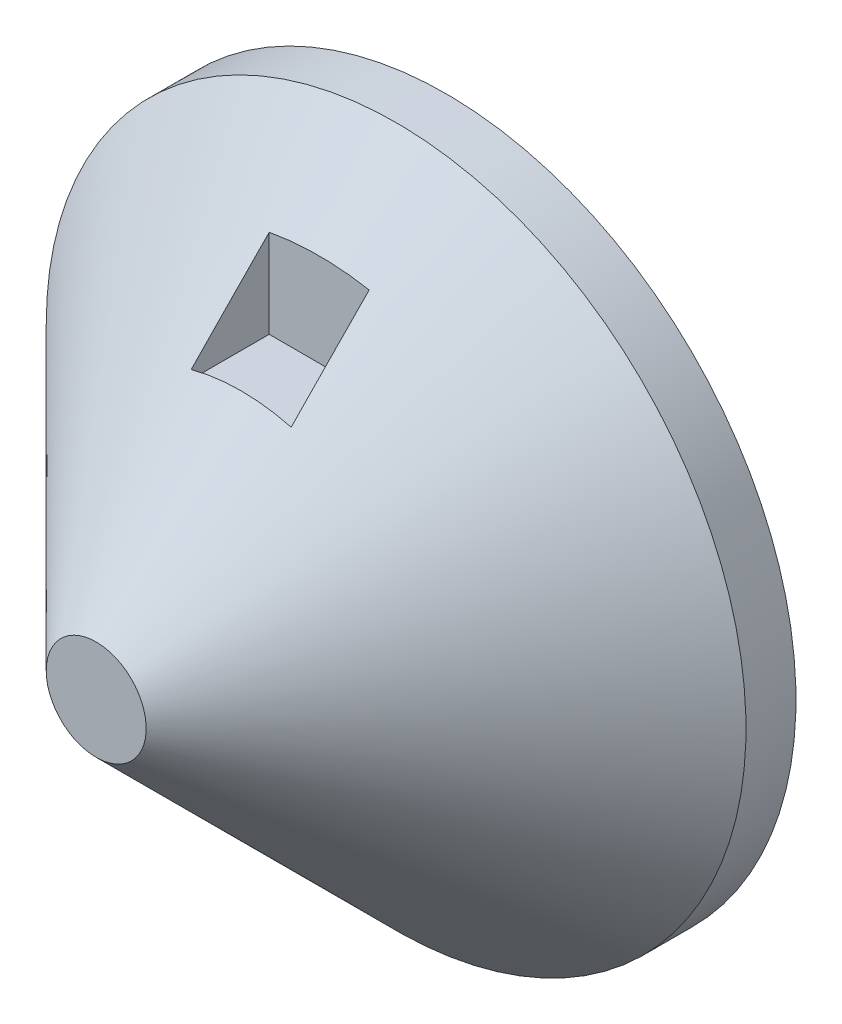
ISO-10303-21;
HEADER;
FILE_DESCRIPTION(('STEP AP214'),'2;1');
FILE_NAME('part.step','',(''),(''),'','','');
FILE_SCHEMA(('AUTOMOTIVE_DESIGN { 1 0 10303 214 1 1 1 1 }'));
ENDSEC;
DATA;
#1=APPLICATION_CONTEXT('core data for automotive mechanical design processes');
#2=APPLICATION_PROTOCOL_DEFINITION('international standard','automotive_design',2000,#1);
#3=PRODUCT_CONTEXT('',#1,'mechanical');
#4=PRODUCT('Part','Part','',(#3));
#5=PRODUCT_RELATED_PRODUCT_CATEGORY('part','',(#4));
#6=PRODUCT_DEFINITION_FORMATION('','',#4);
#7=PRODUCT_DEFINITION_CONTEXT('part definition',#1,'design');
#8=PRODUCT_DEFINITION('design','',#6,#7);
#9=PRODUCT_DEFINITION_SHAPE('','',#8);
#10=(LENGTH_UNIT() NAMED_UNIT(*) SI_UNIT(.MILLI.,.METRE.));
#11=(NAMED_UNIT(*) PLANE_ANGLE_UNIT() SI_UNIT($,.RADIAN.));
#12=(NAMED_UNIT(*) SI_UNIT($,.STERADIAN.) SOLID_ANGLE_UNIT());
#13=UNCERTAINTY_MEASURE_WITH_UNIT(LENGTH_MEASURE(1.E-05),#10,'distance_accuracy_value','');
#14=(GEOMETRIC_REPRESENTATION_CONTEXT(3) GLOBAL_UNCERTAINTY_ASSIGNED_CONTEXT((#13)) GLOBAL_UNIT_ASSIGNED_CONTEXT((#10,
#11,#12)) REPRESENTATION_CONTEXT('',''));
#15=CARTESIAN_POINT('',(0.,0.,0.));
#16=DIRECTION('',(0.,0.,1.));
#17=DIRECTION('',(1.,0.,0.));
#18=AXIS2_PLACEMENT_3D('',#15,#16,#17);
#19=CARTESIAN_POINT('',(0.,0.,0.));
#20=DIRECTION('',(0.,0.,1.));
#21=DIRECTION('',(1.,0.,0.));
#22=AXIS2_PLACEMENT_3D('',#19,#20,#21);
#23=PLANE('',#22);
#24=CARTESIAN_POINT('',(0.,0.,0.));
#25=DIRECTION('',(0.,0.,-1.));
#26=DIRECTION('',(-1.,0.,0.));
#27=AXIS2_PLACEMENT_3D('',#24,#25,#26);
#28=CIRCLE('',#27,6.35);
#29=CARTESIAN_POINT('',(-6.35,0.,0.));
#30=VERTEX_POINT('',#29);
#31=EDGE_CURVE('E137',#30,#30,#28,.T.);
#32=ORIENTED_EDGE('',*,*,#31,.F.);
#33=EDGE_LOOP('',(#32));
#34=FACE_BOUND('',#33,.T.);
#35=ADVANCED_FACE('F42',(#34),#23,.T.);
#36=CARTESIAN_POINT('',(0.,0.,-38.1));
#37=DIRECTION('',(0.,0.,-1.));
#38=DIRECTION('',(-1.,0.,0.));
#39=AXIS2_PLACEMENT_3D('',#36,#37,#38);
#40=CONICAL_SURFACE('',#39,44.45,0.785398163397448);
#41=CARTESIAN_POINT('',(6.35,4.68326468658011,-1.54021343973459));
#42=CARTESIAN_POINT('',(6.35,4.85091604175711,-1.63975634393579));
#43=CARTESIAN_POINT('',(6.35,5.01705673081261,-1.74179804749561));
#44=CARTESIAN_POINT('',(6.35,5.34660671925227,-1.95013655899755));
#45=CARTESIAN_POINT('',(6.35,5.51001654926572,-2.05643252634592));
#46=CARTESIAN_POINT('',(6.35,5.83434139318006,-2.27249747710457));
#47=CARTESIAN_POINT('',(6.35,5.99525814985622,-2.38226385466783));
#48=CARTESIAN_POINT('',(6.35,6.3150039083841,-2.60480916325684));
#49=CARTESIAN_POINT('',(6.35,6.47383279221311,-2.71758826350164));
#50=CARTESIAN_POINT('',(6.35,6.94694562160425,-3.05929761429994));
#51=CARTESIAN_POINT('',(6.35,7.25848741112168,-3.29202589251849));
#52=CARTESIAN_POINT('',(6.35,7.87589223128874,-3.76498418509893));
#53=CARTESIAN_POINT('',(6.35,8.1817539988274,-4.00521583693159));
#54=CARTESIAN_POINT('',(6.35,8.78827065464366,-4.4908153128591));
#55=CARTESIAN_POINT('',(6.35,9.08893542545691,-4.7361708221719));
#56=CARTESIAN_POINT('',(6.35,9.68661213681077,-5.23123278426507));
#57=CARTESIAN_POINT('',(6.35,9.98362436211618,-5.48093889414222));
#58=CARTESIAN_POINT('',(6.35,10.5748909723859,-5.98396443213701));
#59=CARTESIAN_POINT('',(6.35,10.8691435021416,-6.23728603741581));
#60=CARTESIAN_POINT('',(6.35,11.4552347277009,-6.74671410560061));
#61=CARTESIAN_POINT('',(6.35,11.7470733766318,-7.00282062236176));
#62=CARTESIAN_POINT('',(6.35,12.3263093213509,-7.51514684782473));
#63=CARTESIAN_POINT('',(6.35,12.6137233454072,-7.77134766166541));
#64=CARTESIAN_POINT('',(6.35,13.1868943257652,-8.28559710328071));
#65=CARTESIAN_POINT('',(6.35,13.4726512747178,-8.54364573923906));
#66=CARTESIAN_POINT('',(6.35,14.3278414379992,-9.32010521938457));
#67=CARTESIAN_POINT('',(6.35,14.8951829329138,-9.84081983082692));
#68=CARTESIAN_POINT('',(6.35,16.0258185810866,-10.8866888208223));
#69=CARTESIAN_POINT('',(6.35,16.5891124634265,-11.4118434915338));
#70=CARTESIAN_POINT('',(6.35,17.7126119249545,-12.4654485899551));
#71=CARTESIAN_POINT('',(6.34999999999999,18.2728174903564,-12.9938990323546));
#72=CARTESIAN_POINT('',(6.34999999999999,19.3907942817901,-14.0532725867463));
#73=CARTESIAN_POINT('',(6.34999999999999,19.9485657086379,-14.5841954869944));
#74=CARTESIAN_POINT('',(6.34999999999999,21.0622232850914,-15.6480163578257));
#75=CARTESIAN_POINT('',(6.34999999999999,21.6181094303327,-16.1809143329752));
#76=CARTESIAN_POINT('',(6.34999999999999,23.2834695103668,-17.7818953341724));
#77=CARTESIAN_POINT('',(6.34999999999999,24.390696935685,-18.8523147210085));
#78=CARTESIAN_POINT('',(6.34999999999999,26.6040626391276,-21.0000925197677));
#79=CARTESIAN_POINT('',(6.34999999999999,27.7101903735909,-22.0774617812353));
#80=CARTESIAN_POINT('',(6.34999999999999,29.9196176512884,-24.2351196991704));
#81=CARTESIAN_POINT('',(6.34999999999999,31.0229171631851,-25.3154083877158));
#82=CARTESIAN_POINT('',(6.34999999999999,33.2273966011593,-27.4780479175219));
#83=CARTESIAN_POINT('',(6.34999999999999,34.3285766187722,-28.5603986655194));
#84=CARTESIAN_POINT('',(6.34999999999999,36.5293791034173,-30.7266827389079));
#85=CARTESIAN_POINT('',(6.34999999999999,37.6290015700431,-31.8106160647115));
#86=CARTESIAN_POINT('',(6.34999999999999,39.8762861877763,-34.0282887448097));
#87=CARTESIAN_POINT('',(6.34999999999999,41.0238933855337,-35.1620837758052));
#88=CARTESIAN_POINT('',(6.34999999999999,43.318098795946,-37.4307157158939));
#89=CARTESIAN_POINT('',(6.34999999999999,44.4646969989701,-38.5655526347253));
#90=CARTESIAN_POINT('',(6.34999999999999,46.7547786807152,-40.8337565019928));
#91=CARTESIAN_POINT('',(6.34999999999999,47.8982637832704,-41.9671218111424));
#92=CARTESIAN_POINT('',(6.34999999999999,50.1845658211019,-44.2345033685426));
#93=CARTESIAN_POINT('',(6.34999999999999,51.3273827629367,-45.3685196101797));
#94=CARTESIAN_POINT('',(6.34999999999999,52.4699450909661,-46.502792148088));
#95=B_SPLINE_CURVE_WITH_KNOTS('',3,(#41,#42,#43,#44,#45,#46,#47,#48,#49,#50,#51,#52,#53,#54,#55,
#56,#57,#58,#59,#60,#61,#62,#63,#64,#65,#66,#67,#68,#69,#70,#71,#72,#73,#74,#75,#76,#77,#78,#79,
#80,#81,#82,#83,#84,#85,#86,#87,#88,#89,#90,#91,#92,#93,#94),.UNSPECIFIED.,.F.,.F.,(4,2,2,2,2,2,
2,2,2,2,2,2,2,2,2,2,2,2,2,2,2,2,2,2,2,2,4),(0.,0.584873434777492,1.16963187034444,
1.75396119221149,2.33832340406905,3.50476340115452,4.67145975538487,5.83561719336928,
6.99968328684385,8.16448269926701,9.32930467699807,10.4843756612337,11.6394517642835,
13.9496482548881,16.2599979595653,18.570357969198,20.880523627915,23.1906946309988,
27.8108220401931,32.4431141601348,37.0754573872492,41.7075958529222,46.3397355268327,
51.1794083555052,56.0191268891485,60.8491034038748,65.6790316849975),.UNSPECIFIED.);
#96=CARTESIAN_POINT('',(6.34999999999999,23.9422892721788,-18.4200568346681));
#97=VERTEX_POINT('',#96);
#98=CARTESIAN_POINT('',(6.34999999999999,34.0896819815195,-28.3260568346681));
#99=VERTEX_POINT('',#98);
#100=EDGE_CURVE('E11',#97,#99,#95,.T.);
#101=ORIENTED_EDGE('',*,*,#100,.F.);
#102=CARTESIAN_POINT('',(0.,0.,-18.4200568346681));
#103=DIRECTION('',(0.,0.,1.));
#104=DIRECTION('',(1.,0.,0.));
#105=AXIS2_PLACEMENT_3D('',#102,#103,#104);
#106=CIRCLE('',#105,24.7700568346681);
#107=CARTESIAN_POINT('',(-6.35,23.9422892721788,-18.4200568346681));
#108=VERTEX_POINT('',#107);
#109=EDGE_CURVE('E55',#108,#97,#106,.F.);
#110=ORIENTED_EDGE('',*,*,#109,.F.);
#111=CARTESIAN_POINT('',(-6.35000000000001,52.4699450909661,-46.502792148088));
#112=CARTESIAN_POINT('',(-6.35000000000001,51.4996237579461,-45.5395020452288));
#113=CARTESIAN_POINT('',(-6.35000000000001,50.5291129183483,-44.5764028943002));
#114=CARTESIAN_POINT('',(-6.35000000000001,48.5876340421358,-42.6506681526817));
#115=CARTESIAN_POINT('',(-6.35000000000001,47.6166660061381,-41.6880325613698));
#116=CARTESIAN_POINT('',(-6.35000000000001,44.7033165526685,-38.8012980615041));
#117=CARTESIAN_POINT('',(-6.35000000000001,42.7601285480489,-36.878012684474));
#118=CARTESIAN_POINT('',(-6.35000000000001,39.8435059461533,-33.9960709272208));
#119=CARTESIAN_POINT('',(-6.35000000000001,38.8712729869209,-33.0361984630356));
#120=CARTESIAN_POINT('',(-6.35000000000001,36.9258068176817,-31.117476184999));
#121=CARTESIAN_POINT('',(-6.35000000000001,35.9525736121409,-30.1586263666203));
#122=CARTESIAN_POINT('',(-6.35000000000001,34.0046679456972,-28.242046248888));
#123=CARTESIAN_POINT('',(-6.35000000000001,33.0299952615375,-27.2843161763971));
#124=CARTESIAN_POINT('',(-6.35000000000001,31.0789979940115,-25.3705077942552));
#125=CARTESIAN_POINT('',(-6.35000000000001,30.1026733841141,-24.4144295116412));
#126=CARTESIAN_POINT('',(-6.35000000000001,28.146725314315,-22.5033736062493));
#127=CARTESIAN_POINT('',(-6.35,27.1670993378842,-21.5483985583609));
#128=CARTESIAN_POINT('',(-6.35,25.2049682290552,-19.6415212893173));
#129=CARTESIAN_POINT('',(-6.35,24.2224632662626,-18.6896188938249));
#130=CARTESIAN_POINT('',(-6.35,22.7458497971275,-17.2652393381297));
#131=CARTESIAN_POINT('',(-6.35,22.2532981243598,-16.7911483415006));
#132=CARTESIAN_POINT('',(-6.35,21.2669377533013,-15.8442785435255));
#133=CARTESIAN_POINT('',(-6.35,20.7731290591755,-15.3714997378423));
#134=CARTESIAN_POINT('',(-6.35,19.7838781028635,-14.4274511896756));
#135=CARTESIAN_POINT('',(-6.35,19.2884355279432,-13.9561817747595));
#136=CARTESIAN_POINT('',(-6.35,18.2956472258398,-13.0156379017116));
#137=CARTESIAN_POINT('',(-6.35,17.7983014745021,-12.5463634690602));
#138=CARTESIAN_POINT('',(-6.35,16.8003335574214,-11.6095118546528));
#139=CARTESIAN_POINT('',(-6.35,16.2997071164562,-11.1419392235884));
#140=CARTESIAN_POINT('',(-6.35,15.2954165919405,-10.2101068550419));
#141=CARTESIAN_POINT('',(-6.35,14.7917526403826,-9.74584697549381));
#142=CARTESIAN_POINT('',(-6.35,13.7807499032591,-8.82199435746283));
#143=CARTESIAN_POINT('',(-6.35,13.2734136786461,-8.36239881957025));
#144=CARTESIAN_POINT('',(-6.35,12.253319787589,-7.44907468236451));
#145=CARTESIAN_POINT('',(-6.35,11.7405612620142,-6.99534703888854));
#146=CARTESIAN_POINT('',(-6.35,10.9652545680834,-6.3205648576352));
#147=CARTESIAN_POINT('',(-6.35,10.7054699641489,-6.09633553637571));
#148=CARTESIAN_POINT('',(-6.35,10.1836820989348,-5.65047762843926));
#149=CARTESIAN_POINT('',(-6.35,9.92167887188595,-5.42884900176208));
#150=CARTESIAN_POINT('',(-6.35,9.39512892820773,-4.98887284927709));
#151=CARTESIAN_POINT('',(-6.35,9.13058341485961,-4.77052388558527));
#152=CARTESIAN_POINT('',(-6.35,8.59825226475551,-4.33776844899452));
#153=CARTESIAN_POINT('',(-6.35,8.3304664288287,-4.12336222050313));
#154=CARTESIAN_POINT('',(-6.35,7.79031112410424,-3.69905159222716));
#155=CARTESIAN_POINT('',(-6.35,7.51793225881084,-3.48915912844766));
#156=CARTESIAN_POINT('',(-6.35,6.96832835533729,-3.07588036031682));
#157=CARTESIAN_POINT('',(-6.35,6.69110418672549,-2.87249290670584));
#158=CARTESIAN_POINT('',(-6.35,6.27049190843936,-2.57366866784916));
#159=CARTESIAN_POINT('',(-6.35,6.12937837062598,-2.47502791931152));
#160=CARTESIAN_POINT('',(-6.35,5.84544560682943,-2.28024089244568));
#161=CARTESIAN_POINT('',(-6.35,5.70262645327639,-2.18409450873879));
#162=CARTESIAN_POINT('',(-6.35,5.41499390483652,-1.99463418733478));
#163=CARTESIAN_POINT('',(-6.35,5.270179374335,-1.90132196833942));
#164=CARTESIAN_POINT('',(-6.35,4.97839213840502,-1.71809033940632));
#165=CARTESIAN_POINT('',(-6.35,4.83141911608863,-1.62817143469939));
#166=CARTESIAN_POINT('',(-6.35,4.68326468658011,-1.54021343973459));
#167=B_SPLINE_CURVE_WITH_KNOTS('',3,(#111,#112,#113,#114,#115,#116,#117,#118,#119,#120,#121,
#122,#123,#124,#125,#126,#127,#128,#129,#130,#131,#132,#133,#134,#135,#136,#137,#138,#139,#140,
#141,#142,#143,#144,#145,#146,#147,#148,#149,#150,#151,#152,#153,#154,#155,#156,#157,#158,#159,
#160,#161,#162,#163,#164,#165,#166),.UNSPECIFIED.,.F.,.F.,(4,2,2,2,2,2,2,2,2,2,2,2,2,2,2,2,2,2,
2,2,2,2,2,2,2,2,2,4),(0.,4.10183625147547,8.20366698339806,16.4058011214059,20.504498988406,
24.6031786341775,28.7025800018154,32.8020478458569,36.9062854181194,41.0102858787057,
43.0612166919341,45.1121407181936,47.1634831853432,49.2148517744932,51.2698977843133,
53.3248551281517,55.3784959872468,57.4324672595365,58.4619692959549,59.4914554772096,
60.5204762952817,61.5495606880933,62.5810956378231,63.6124473250195,64.1289403695138,
64.6454115582279,65.1621899348084,65.6790449534031),.UNSPECIFIED.);
#168=CARTESIAN_POINT('',(-6.35,34.0896819815195,-28.3260568346681));
#169=VERTEX_POINT('',#168);
#170=EDGE_CURVE('E144',#169,#108,#167,.T.);
#171=ORIENTED_EDGE('',*,*,#170,.F.);
#172=CARTESIAN_POINT('',(0.,0.,-28.3260568346681));
#173=DIRECTION('',(0.,0.,-1.));
#174=DIRECTION('',(-1.,0.,0.));
#175=AXIS2_PLACEMENT_3D('',#172,#173,#174);
#176=CIRCLE('',#175,34.6760568346681);
#177=EDGE_CURVE('E141',#99,#169,#176,.F.);
#178=ORIENTED_EDGE('',*,*,#177,.F.);
#179=EDGE_LOOP('',(#101,#110,#171,#178));
#180=FACE_BOUND('',#179,.T.);
#181=ORIENTED_EDGE('',*,*,#31,.T.);
#182=EDGE_LOOP('',(#181));
#183=FACE_BOUND('',#182,.T.);
#184=CARTESIAN_POINT('',(0.,0.,-38.1));
#185=DIRECTION('',(0.,0.,-1.));
#186=DIRECTION('',(-1.,0.,0.));
#187=AXIS2_PLACEMENT_3D('',#184,#185,#186);
#188=CIRCLE('',#187,44.45);
#189=CARTESIAN_POINT('',(-44.45,0.,-38.1));
#190=VERTEX_POINT('',#189);
#191=EDGE_CURVE('E133',#190,#190,#188,.T.);
#192=ORIENTED_EDGE('',*,*,#191,.F.);
#193=EDGE_LOOP('',(#192));
#194=FACE_BOUND('',#193,.T.);
#195=ADVANCED_FACE('F151',(#180,#183,#194),#40,.T.);
#196=CARTESIAN_POINT('',(0.,0.,-6.35));
#197=DIRECTION('',(0.,0.,-1.));
#198=DIRECTION('',(-1.,0.,0.));
#199=AXIS2_PLACEMENT_3D('',#196,#197,#198);
#200=CYLINDRICAL_SURFACE('',#199,44.45);
#201=ORIENTED_EDGE('',*,*,#191,.T.);
#202=EDGE_LOOP('',(#201));
#203=FACE_BOUND('',#202,.T.);
#204=CARTESIAN_POINT('',(0.,0.,-44.45));
#205=DIRECTION('',(0.,0.,-1.));
#206=DIRECTION('',(-1.,0.,0.));
#207=AXIS2_PLACEMENT_3D('',#204,#205,#206);
#208=CIRCLE('',#207,44.45);
#209=CARTESIAN_POINT('',(-44.45,0.,-44.45));
#210=VERTEX_POINT('',#209);
#211=EDGE_CURVE('E129',#210,#210,#208,.T.);
#212=ORIENTED_EDGE('',*,*,#211,.F.);
#213=EDGE_LOOP('',(#212));
#214=FACE_BOUND('',#213,.T.);
#215=ADVANCED_FACE('F172',(#203,#214),#200,.T.);
#216=CARTESIAN_POINT('',(0.,44.45,-44.45));
#217=DIRECTION('',(0.,0.,-1.));
#218=DIRECTION('',(-1.,0.,0.));
#219=AXIS2_PLACEMENT_3D('',#216,#217,#218);
#220=PLANE('',#219);
#221=ORIENTED_EDGE('',*,*,#211,.T.);
#222=EDGE_LOOP('',(#221));
#223=FACE_BOUND('',#222,.T.);
#224=CARTESIAN_POINT('',(0.,0.,-44.45));
#225=DIRECTION('',(0.,0.,-1.));
#226=DIRECTION('',(-1.,0.,0.));
#227=AXIS2_PLACEMENT_3D('',#224,#225,#226);
#228=CIRCLE('',#227,38.1);
#229=CARTESIAN_POINT('',(-38.1,0.,-44.45));
#230=VERTEX_POINT('',#229);
#231=EDGE_CURVE('E119',#230,#230,#228,.T.);
#232=ORIENTED_EDGE('',*,*,#231,.F.);
#233=EDGE_LOOP('',(#232));
#234=FACE_BOUND('',#233,.T.);
#235=ADVANCED_FACE('F169',(#223,#234),#220,.T.);
#236=CARTESIAN_POINT('',(0.,0.,-6.35));
#237=DIRECTION('',(0.,0.,-1.));
#238=DIRECTION('',(-1.,0.,0.));
#239=AXIS2_PLACEMENT_3D('',#236,#237,#238);
#240=CONICAL_SURFACE('',#239,0.,0.785398163397448);
#241=ORIENTED_EDGE('',*,*,#231,.T.);
#242=EDGE_LOOP('',(#241));
#243=FACE_BOUND('',#242,.T.);
#244=CARTESIAN_POINT('',(0.,0.,-6.35));
#245=VERTEX_POINT('',#244);
#246=VERTEX_LOOP('',#245);
#247=FACE_BOUND('',#246,.T.);
#248=ADVANCED_FACE('F166',(#243,#247),#240,.F.);
#249=CARTESIAN_POINT('',(6.34999999999999,22.86,-18.4200568346681));
#250=DIRECTION('',(1.,0.,0.));
#251=DIRECTION('',(0.,0.,-1.));
#252=AXIS2_PLACEMENT_3D('',#249,#250,#251);
#253=PLANE('',#252);
#254=ORIENTED_EDGE('',*,*,#100,.T.);
#255=DIRECTION('',(0.,1.,0.));
#256=VECTOR('',#255,1.);
#257=CARTESIAN_POINT('',(6.34999999999999,22.86,-28.3260568346681));
#258=LINE('',#257,#256);
#259=CARTESIAN_POINT('',(6.34999999999999,22.86,-28.3260568346681));
#260=VERTEX_POINT('',#259);
#261=EDGE_CURVE('E62',#260,#99,#258,.T.);
#262=ORIENTED_EDGE('',*,*,#261,.F.);
#263=DIRECTION('',(0.,0.,-1.));
#264=VECTOR('',#263,1.);
#265=CARTESIAN_POINT('',(6.34999999999999,22.86,-18.4200568346681));
#266=LINE('',#265,#264);
#267=CARTESIAN_POINT('',(6.34999999999999,22.86,-18.4200568346681));
#268=VERTEX_POINT('',#267);
#269=EDGE_CURVE('E89',#268,#260,#266,.T.);
#270=ORIENTED_EDGE('',*,*,#269,.F.);
#271=DIRECTION('',(0.,1.,0.));
#272=VECTOR('',#271,1.);
#273=CARTESIAN_POINT('',(6.34999999999999,22.86,-18.4200568346681));
#274=LINE('',#273,#272);
#275=EDGE_CURVE('E116',#268,#97,#274,.T.);
#276=ORIENTED_EDGE('',*,*,#275,.T.);
#277=EDGE_LOOP('',(#254,#262,#270,#276));
#278=FACE_BOUND('',#277,.T.);
#279=ADVANCED_FACE('F86',(#278),#253,.F.);
#280=CARTESIAN_POINT('',(-6.35,22.86,-18.4200568346681));
#281=DIRECTION('',(0.,0.,1.));
#282=DIRECTION('',(1.,0.,0.));
#283=AXIS2_PLACEMENT_3D('',#280,#281,#282);
#284=PLANE('',#283);
#285=ORIENTED_EDGE('',*,*,#109,.T.);
#286=ORIENTED_EDGE('',*,*,#275,.F.);
#287=DIRECTION('',(1.,0.,0.));
#288=VECTOR('',#287,1.);
#289=CARTESIAN_POINT('',(-6.35,22.86,-18.4200568346681));
#290=LINE('',#289,#288);
#291=CARTESIAN_POINT('',(-6.35,22.86,-18.4200568346681));
#292=VERTEX_POINT('',#291);
#293=EDGE_CURVE('E95',#292,#268,#290,.T.);
#294=ORIENTED_EDGE('',*,*,#293,.F.);
#295=DIRECTION('',(0.,1.,0.));
#296=VECTOR('',#295,1.);
#297=CARTESIAN_POINT('',(-6.35,22.86,-18.4200568346681));
#298=LINE('',#297,#296);
#299=EDGE_CURVE('E120',#292,#108,#298,.T.);
#300=ORIENTED_EDGE('',*,*,#299,.T.);
#301=EDGE_LOOP('',(#285,#286,#294,#300));
#302=FACE_BOUND('',#301,.T.);
#303=ADVANCED_FACE('F159',(#302),#284,.F.);
#304=CARTESIAN_POINT('',(-6.35,22.86,-18.4200568346681));
#305=DIRECTION('',(-1.,0.,0.));
#306=DIRECTION('',(0.,0.,1.));
#307=AXIS2_PLACEMENT_3D('',#304,#305,#306);
#308=PLANE('',#307);
#309=ORIENTED_EDGE('',*,*,#170,.T.);
#310=ORIENTED_EDGE('',*,*,#299,.F.);
#311=DIRECTION('',(0.,0.,1.));
#312=VECTOR('',#311,1.);
#313=CARTESIAN_POINT('',(-6.35,22.86,-18.4200568346681));
#314=LINE('',#313,#312);
#315=CARTESIAN_POINT('',(-6.35000000000001,22.86,-28.3260568346681));
#316=VERTEX_POINT('',#315);
#317=EDGE_CURVE('E105',#316,#292,#314,.T.);
#318=ORIENTED_EDGE('',*,*,#317,.F.);
#319=DIRECTION('',(0.,1.,0.));
#320=VECTOR('',#319,1.);
#321=CARTESIAN_POINT('',(-6.35000000000001,22.86,-28.3260568346681));
#322=LINE('',#321,#320);
#323=EDGE_CURVE('E94',#316,#169,#322,.T.);
#324=ORIENTED_EDGE('',*,*,#323,.T.);
#325=EDGE_LOOP('',(#309,#310,#318,#324));
#326=FACE_BOUND('',#325,.T.);
#327=ADVANCED_FACE('F154',(#326),#308,.F.);
#328=CARTESIAN_POINT('',(-6.35000000000001,22.86,-28.3260568346681));
#329=DIRECTION('',(0.,0.,-1.));
#330=DIRECTION('',(-1.,0.,0.));
#331=AXIS2_PLACEMENT_3D('',#328,#329,#330);
#332=PLANE('',#331);
#333=ORIENTED_EDGE('',*,*,#177,.T.);
#334=ORIENTED_EDGE('',*,*,#323,.F.);
#335=DIRECTION('',(-1.,0.,0.));
#336=VECTOR('',#335,1.);
#337=CARTESIAN_POINT('',(-6.35000000000001,22.86,-28.3260568346681));
#338=LINE('',#337,#336);
#339=EDGE_CURVE('E98',#260,#316,#338,.T.);
#340=ORIENTED_EDGE('',*,*,#339,.F.);
#341=ORIENTED_EDGE('',*,*,#261,.T.);
#342=EDGE_LOOP('',(#333,#334,#340,#341));
#343=FACE_BOUND('',#342,.T.);
#344=ADVANCED_FACE('F99',(#343),#332,.F.);
#345=CARTESIAN_POINT('',(0.,22.86,0.));
#346=DIRECTION('',(0.,-1.,0.));
#347=DIRECTION('',(0.,0.,-1.));
#348=AXIS2_PLACEMENT_3D('',#345,#346,#347);
#349=PLANE('',#348);
#350=ORIENTED_EDGE('',*,*,#269,.T.);
#351=ORIENTED_EDGE('',*,*,#339,.T.);
#352=ORIENTED_EDGE('',*,*,#317,.T.);
#353=ORIENTED_EDGE('',*,*,#293,.T.);
#354=EDGE_LOOP('',(#350,#351,#352,#353));
#355=FACE_BOUND('',#354,.T.);
#356=ADVANCED_FACE('F107',(#355),#349,.F.);
#357=CLOSED_SHELL('',(#35,#195,#215,#235,#248,#279,#303,#327,#344,#356));
#358=MANIFOLD_SOLID_BREP('B2',#357);
#359=ADVANCED_BREP_SHAPE_REPRESENTATION('',(#18,#358),#14);
#360=SHAPE_DEFINITION_REPRESENTATION(#9,#359);
ENDSEC;
END-ISO-10303-21;
